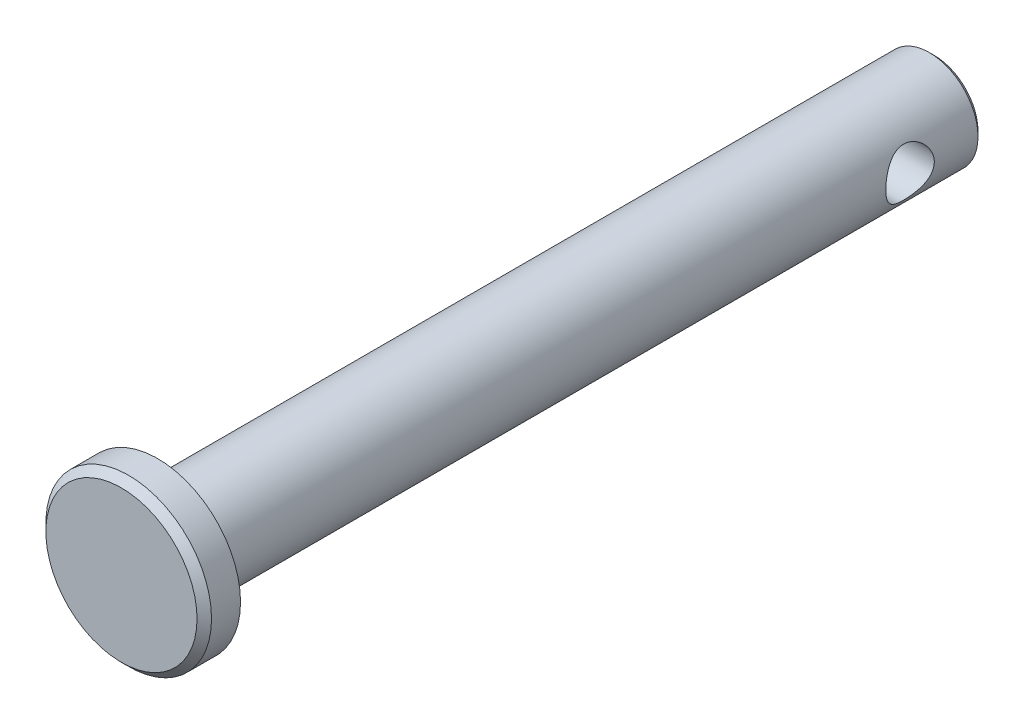
ISO-10303-21;
HEADER;
FILE_DESCRIPTION(('STEP AP214'),'2;1');
FILE_NAME('part.step','',(''),(''),'','','');
FILE_SCHEMA(('AUTOMOTIVE_DESIGN { 1 0 10303 214 1 1 1 1 }'));
ENDSEC;
DATA;
#1=APPLICATION_CONTEXT('core data for automotive mechanical design processes');
#2=APPLICATION_PROTOCOL_DEFINITION('international standard','automotive_design',2000,#1);
#3=PRODUCT_CONTEXT('',#1,'mechanical');
#4=PRODUCT('Part','Part','',(#3));
#5=PRODUCT_RELATED_PRODUCT_CATEGORY('part','',(#4));
#6=PRODUCT_DEFINITION_FORMATION('','',#4);
#7=PRODUCT_DEFINITION_CONTEXT('part definition',#1,'design');
#8=PRODUCT_DEFINITION('design','',#6,#7);
#9=PRODUCT_DEFINITION_SHAPE('','',#8);
#10=(LENGTH_UNIT() NAMED_UNIT(*) SI_UNIT(.MILLI.,.METRE.));
#11=(NAMED_UNIT(*) PLANE_ANGLE_UNIT() SI_UNIT($,.RADIAN.));
#12=(NAMED_UNIT(*) SI_UNIT($,.STERADIAN.) SOLID_ANGLE_UNIT());
#13=UNCERTAINTY_MEASURE_WITH_UNIT(LENGTH_MEASURE(1.E-05),#10,'distance_accuracy_value','');
#14=(GEOMETRIC_REPRESENTATION_CONTEXT(3) GLOBAL_UNCERTAINTY_ASSIGNED_CONTEXT((#13)) GLOBAL_UNIT_ASSIGNED_CONTEXT((#10,
#11,#12)) REPRESENTATION_CONTEXT('',''));
#15=CARTESIAN_POINT('',(0.,0.,0.));
#16=DIRECTION('',(0.,0.,1.));
#17=DIRECTION('',(1.,0.,0.));
#18=AXIS2_PLACEMENT_3D('',#15,#16,#17);
#19=CARTESIAN_POINT('',(0.,0.,19.05));
#20=DIRECTION('',(0.,0.,-1.));
#21=DIRECTION('',(-1.,0.,0.));
#22=AXIS2_PLACEMENT_3D('',#19,#20,#21);
#23=CYLINDRICAL_SURFACE('',#22,2.38125);
#24=CARTESIAN_POINT('',(0.,0.,-18.8118749999999));
#25=DIRECTION('',(0.,0.,1.));
#26=DIRECTION('',(1.,0.,0.));
#27=AXIS2_PLACEMENT_3D('',#24,#25,#26);
#28=CIRCLE('',#27,2.38125);
#29=CARTESIAN_POINT('',(2.38125,0.,-18.8118749999999));
#30=VERTEX_POINT('',#29);
#31=EDGE_CURVE('E36',#30,#30,#28,.T.);
#32=ORIENTED_EDGE('',*,*,#31,.T.);
#33=EDGE_LOOP('',(#32));
#34=FACE_BOUND('',#33,.T.);
#35=CARTESIAN_POINT('',(-2.38125,0.,-14.2875));
#36=CARTESIAN_POINT('',(-2.38124658771817,-0.0625934933908991,-14.2875039318241));
#37=CARTESIAN_POINT('',(-2.37875553370113,-0.125261607765469,-14.2924649933105));
#38=CARTESIAN_POINT('',(-2.36903604532025,-0.248745655116468,-14.3120898356559));
#39=CARTESIAN_POINT('',(-2.36179861446384,-0.309557840743265,-14.3267720429128));
#40=CARTESIAN_POINT('',(-2.34334382664568,-0.427355251873435,-14.3651213783844));
#41=CARTESIAN_POINT('',(-2.33214194770735,-0.484354349749462,-14.3887535887453));
#42=CARTESIAN_POINT('',(-2.30678565164099,-0.593493959385317,-14.4441512710626));
#43=CARTESIAN_POINT('',(-2.29263146732422,-0.645634853781904,-14.4759161017463));
#44=CARTESIAN_POINT('',(-2.26166669988499,-0.747126495522786,-14.5488627251684));
#45=CARTESIAN_POINT('',(-2.24474721461222,-0.796117610742266,-14.5904979643447));
#46=CARTESIAN_POINT('',(-2.2105140207503,-0.886753026544746,-14.6810271362285));
#47=CARTESIAN_POINT('',(-2.19320002298882,-0.928391728636495,-14.7299265485166));
#48=CARTESIAN_POINT('',(-2.15859063769341,-1.00637816303611,-14.8381442380263));
#49=CARTESIAN_POINT('',(-2.14140081986313,-1.04206516514117,-14.8979764170931));
#50=CARTESIAN_POINT('',(-2.11081118475794,-1.10271904514174,-15.0237436094086));
#51=CARTESIAN_POINT('',(-2.09740866244572,-1.12769358094429,-15.0896742220105));
#52=CARTESIAN_POINT('',(-2.07713897941891,-1.16458893898079,-15.221741891143));
#53=CARTESIAN_POINT('',(-2.06992860854359,-1.1772017235864,-15.2876303007427));
#54=CARTESIAN_POINT('',(-2.06194687719966,-1.19113338890835,-15.4209498037312));
#55=CARTESIAN_POINT('',(-2.06116915374352,-1.19246343021919,-15.4883793064747));
#56=CARTESIAN_POINT('',(-2.06586451337536,-1.18429955128952,-15.6141967977005));
#57=CARTESIAN_POINT('',(-2.07060121735085,-1.17608099119853,-15.6727017371749));
#58=CARTESIAN_POINT('',(-2.0845013483624,-1.15126275778341,-15.7873563983473));
#59=CARTESIAN_POINT('',(-2.09366618546583,-1.13466041470314,-15.8435053636291));
#60=CARTESIAN_POINT('',(-2.1155915160392,-1.09324351977209,-15.953457185961));
#61=CARTESIAN_POINT('',(-2.12843079040573,-1.06824668928498,-16.0071749310543));
#62=CARTESIAN_POINT('',(-2.15626240722546,-1.01089025937972,-16.109911454615));
#63=CARTESIAN_POINT('',(-2.17125571566414,-0.978527352789222,-16.1589281083239));
#64=CARTESIAN_POINT('',(-2.204003536286,-0.902572396630542,-16.2574143665474));
#65=CARTESIAN_POINT('',(-2.22186710625626,-0.858076839495929,-16.3061533401016));
#66=CARTESIAN_POINT('',(-2.25680138992047,-0.761470860938951,-16.3957818577598));
#67=CARTESIAN_POINT('',(-2.27387172175947,-0.709356821108762,-16.4366676505153));
#68=CARTESIAN_POINT('',(-2.30626428608779,-0.595927464756048,-16.5112132401635));
#69=CARTESIAN_POINT('',(-2.3214685301789,-0.53429724499805,-16.5444493125057));
#70=CARTESIAN_POINT('',(-2.34741102209979,-0.405367587816353,-16.5998092752043));
#71=CARTESIAN_POINT('',(-2.35815281492167,-0.338072701740849,-16.6219419890337));
#72=CARTESIAN_POINT('',(-2.37320534860897,-0.205700104133527,-16.6526472775502));
#73=CARTESIAN_POINT('',(-2.37797504664999,-0.140900384809102,-16.662191127561));
#74=CARTESIAN_POINT('',(-2.38211931649743,-0.0104532111897023,-16.670493945507));
#75=CARTESIAN_POINT('',(-2.38149644415062,0.0551938267825986,-16.6692580225895));
#76=CARTESIAN_POINT('',(-2.37519200776753,0.180061757270821,-16.6565976616014));
#77=CARTESIAN_POINT('',(-2.36990626897501,0.239386357709475,-16.6459703282183));
#78=CARTESIAN_POINT('',(-2.35532022721706,0.355290706146969,-16.6160790456499));
#79=CARTESIAN_POINT('',(-2.34601948166815,0.411870150775843,-16.5968141443165));
#80=CARTESIAN_POINT('',(-2.323912493394,0.522551749435383,-16.549689325903));
#81=CARTESIAN_POINT('',(-2.31101362357334,0.576536816435452,-16.5215994059547));
#82=CARTESIAN_POINT('',(-2.28295169421308,0.679205558772778,-16.4578813403714));
#83=CARTESIAN_POINT('',(-2.26778767095513,0.727886962326196,-16.4222499834997));
#84=CARTESIAN_POINT('',(-2.23490101029918,0.823635905061685,-16.3404227435881));
#85=CARTESIAN_POINT('',(-2.21707334772675,0.870075505159961,-16.2935330222475));
#86=CARTESIAN_POINT('',(-2.18196785003363,0.954710182325452,-16.19258911677));
#87=CARTESIAN_POINT('',(-2.1646904022613,0.992899556088159,-16.1385300179093));
#88=CARTESIAN_POINT('',(-2.13182825744162,1.06168973569882,-16.0214742742178));
#89=CARTESIAN_POINT('',(-2.11636605630571,1.09183348103051,-15.9581715861704));
#90=CARTESIAN_POINT('',(-2.090428799133,1.14071736472269,-15.8263708256536));
#91=CARTESIAN_POINT('',(-2.07994732092736,1.15947219672864,-15.7578795762595));
#92=CARTESIAN_POINT('',(-2.06646662138444,1.18331657161978,-15.6246787659056));
#93=CARTESIAN_POINT('',(-2.06284572182647,1.18954509883978,-15.5602373420111));
#94=CARTESIAN_POINT('',(-2.06175000375602,1.19144552443463,-15.4311583356499));
#95=CARTESIAN_POINT('',(-2.06427252119055,1.18712199863718,-15.3665208503446));
#96=CARTESIAN_POINT('',(-2.0745195450331,1.16910579328329,-15.2453774559884));
#97=CARTESIAN_POINT('',(-2.081725593681,1.1563448992644,-15.1886835027343));
#98=CARTESIAN_POINT('',(-2.09991741148739,1.12296816088622,-15.07830345781));
#99=CARTESIAN_POINT('',(-2.11090439637645,1.10234978978715,-15.0246183400718));
#100=CARTESIAN_POINT('',(-2.13632093965266,1.05229312174863,-14.9177872867941));
#101=CARTESIAN_POINT('',(-2.15093219477964,1.02235532346272,-14.864919904384));
#102=CARTESIAN_POINT('',(-2.18164566727434,0.955061000604871,-14.76461375536));
#103=CARTESIAN_POINT('',(-2.19774865799103,0.917700616381019,-14.7171778333514));
#104=CARTESIAN_POINT('',(-2.23197328511557,0.831298335810091,-14.6230872022555));
#105=CARTESIAN_POINT('',(-2.25010245755217,0.781388641146488,-14.5772277562503));
#106=CARTESIAN_POINT('',(-2.28454448778714,0.674078066156023,-14.4943556353612));
#107=CARTESIAN_POINT('',(-2.30085636405197,0.616673173627613,-14.4573477289956));
#108=CARTESIAN_POINT('',(-2.33002942662263,0.495218557463752,-14.3931842055862));
#109=CARTESIAN_POINT('',(-2.34286539970213,0.431124721872153,-14.3661000982945));
#110=CARTESIAN_POINT('',(-2.36340659560876,0.298539814353399,-14.3234471500715));
#111=CARTESIAN_POINT('',(-2.37112639390897,0.230061848926334,-14.3078455823685));
#112=CARTESIAN_POINT('',(-2.37762409336193,0.13406669253178,-14.2947658949378));
#113=CARTESIAN_POINT('',(-2.37898025606987,0.107348987707654,-14.2920450432218));
#114=CARTESIAN_POINT('',(-2.3807939546427,0.0537587806828975,-14.288411226369));
#115=CARTESIAN_POINT('',(-2.38125146570418,0.0268862742301637,-14.2874983111327));
#116=CARTESIAN_POINT('',(-2.38125,0.,-14.2875));
#117=B_SPLINE_CURVE_WITH_KNOTS('',3,(#35,#36,#37,#38,#39,#40,#41,#42,#43,#44,#45,#46,#47,#48,
#49,#50,#51,#52,#53,#54,#55,#56,#57,#58,#59,#60,#61,#62,#63,#64,#65,#66,#67,#68,#69,#70,#71,#72,
#73,#74,#75,#76,#77,#78,#79,#80,#81,#82,#83,#84,#85,#86,#87,#88,#89,#90,#91,#92,#93,#94,#95,#96,
#97,#98,#99,#100,#101,#102,#103,#104,#105,#106,#107,#108,#109,#110,#111,#112,#113,#114,#115,
#116),.UNSPECIFIED.,.T.,.F.,(4,2,2,2,2,2,2,2,2,2,2,2,2,2,2,2,2,2,2,2,2,2,2,2,2,2,2,2,2,2,2,2,2,
2,2,2,2,2,2,2,4),(0.,0.187671381491035,0.375699515747514,0.563001503883019,0.75028872744243,
0.948906406473726,1.14767467670684,1.36185743031615,1.57588681716391,1.77710320704462,
1.97812053569866,2.15509926337348,2.33213438424011,2.51329317200606,2.69453345625452,
2.8987544577565,3.10307277131562,3.31687910824069,3.53051527011183,3.72645730217446,
3.92230647121477,4.10297598058852,4.28366541066829,4.46952119208218,4.65545627297242,
4.85965036423512,5.06398516445249,5.27821543446363,5.4921687202949,5.68558331740252,
5.8789140564582,6.05382723196981,6.22879670208068,6.41552156348467,6.60234377481073,
6.81186617152195,7.02150118957733,7.23261841267422,7.44313156831559,7.52374130413948,
7.60435326481741),.UNSPECIFIED.);
#118=CARTESIAN_POINT('',(-2.38125,0.,-14.2875));
#119=VERTEX_POINT('',#118);
#120=EDGE_CURVE('E47',#119,#119,#117,.T.);
#121=ORIENTED_EDGE('',*,*,#120,.T.);
#122=EDGE_LOOP('',(#121));
#123=FACE_BOUND('',#122,.T.);
#124=CARTESIAN_POINT('',(2.38125,0.,-16.66875));
#125=CARTESIAN_POINT('',(2.38124658771817,-0.0625934933908996,-16.6687460681758));
#126=CARTESIAN_POINT('',(2.37875553370113,-0.12526160776547,-16.6637850066895));
#127=CARTESIAN_POINT('',(2.36903604532025,-0.248745655116469,-16.6441601643441));
#128=CARTESIAN_POINT('',(2.36179861446383,-0.309557840743266,-16.6294779570872));
#129=CARTESIAN_POINT('',(2.34334382664568,-0.427355251873435,-16.5911286216156));
#130=CARTESIAN_POINT('',(2.33214194770735,-0.484354349749462,-16.5674964112547));
#131=CARTESIAN_POINT('',(2.30678565164099,-0.593493959385318,-16.5120987289374));
#132=CARTESIAN_POINT('',(2.29263146732421,-0.645634853781904,-16.4803338982537));
#133=CARTESIAN_POINT('',(2.26166669988499,-0.747126495522786,-16.4073872748316));
#134=CARTESIAN_POINT('',(2.24474721461222,-0.796117610742266,-16.3657520356553));
#135=CARTESIAN_POINT('',(2.2105140207503,-0.886753026544747,-16.2752228637715));
#136=CARTESIAN_POINT('',(2.19320002298882,-0.928391728636496,-16.2263234514834));
#137=CARTESIAN_POINT('',(2.15859063769341,-1.00637816303612,-16.1181057619737));
#138=CARTESIAN_POINT('',(2.14140081986313,-1.04206516514117,-16.0582735829069));
#139=CARTESIAN_POINT('',(2.11081118475794,-1.10271904514174,-15.9325063905914));
#140=CARTESIAN_POINT('',(2.09740866244572,-1.12769358094429,-15.8665757779895));
#141=CARTESIAN_POINT('',(2.0771389794189,-1.16458893898079,-15.734508108857));
#142=CARTESIAN_POINT('',(2.06992860854359,-1.1772017235864,-15.6686196992573));
#143=CARTESIAN_POINT('',(2.06194687719966,-1.19113338890835,-15.5353001962688));
#144=CARTESIAN_POINT('',(2.06116915374352,-1.19246343021919,-15.4678706935253));
#145=CARTESIAN_POINT('',(2.06586451337536,-1.18429955128952,-15.3420532022995));
#146=CARTESIAN_POINT('',(2.07060121735085,-1.17608099119853,-15.2835482628251));
#147=CARTESIAN_POINT('',(2.0845013483624,-1.15126275778341,-15.1688936016527));
#148=CARTESIAN_POINT('',(2.09366618546583,-1.13466041470315,-15.1127446363709));
#149=CARTESIAN_POINT('',(2.1155915160392,-1.09324351977209,-15.002792814039));
#150=CARTESIAN_POINT('',(2.12843079040573,-1.06824668928498,-14.9490750689457));
#151=CARTESIAN_POINT('',(2.15626240722546,-1.01089025937972,-14.846338545385));
#152=CARTESIAN_POINT('',(2.17125571566414,-0.978527352789223,-14.7973218916761));
#153=CARTESIAN_POINT('',(2.20400353628599,-0.902572396630543,-14.6988356334526));
#154=CARTESIAN_POINT('',(2.22186710625626,-0.858076839495929,-14.6500966598984));
#155=CARTESIAN_POINT('',(2.25680138992047,-0.761470860938951,-14.5604681422402));
#156=CARTESIAN_POINT('',(2.27387172175947,-0.709356821108761,-14.5195823494847));
#157=CARTESIAN_POINT('',(2.30626428608779,-0.595927464756047,-14.4450367598365));
#158=CARTESIAN_POINT('',(2.3214685301789,-0.534297244998048,-14.4118006874943));
#159=CARTESIAN_POINT('',(2.34741102209979,-0.40536758781635,-14.3564407247957));
#160=CARTESIAN_POINT('',(2.35815281492167,-0.338072701740845,-14.3343080109663));
#161=CARTESIAN_POINT('',(2.37320534860897,-0.205700104133523,-14.3036027224498));
#162=CARTESIAN_POINT('',(2.37797504664999,-0.140900384809099,-14.294058872439));
#163=CARTESIAN_POINT('',(2.38211931649743,-0.0104532111896992,-14.285756054493));
#164=CARTESIAN_POINT('',(2.38149644415062,0.0551938267826013,-14.2869919774105));
#165=CARTESIAN_POINT('',(2.37519200776753,0.180061757270824,-14.2996523383986));
#166=CARTESIAN_POINT('',(2.36990626897501,0.239386357709477,-14.3102796717817));
#167=CARTESIAN_POINT('',(2.35532022721706,0.35529070614697,-14.3401709543501));
#168=CARTESIAN_POINT('',(2.34601948166815,0.411870150775843,-14.3594358556835));
#169=CARTESIAN_POINT('',(2.323912493394,0.522551749435383,-14.406560674097));
#170=CARTESIAN_POINT('',(2.31101362357334,0.576536816435452,-14.4346505940453));
#171=CARTESIAN_POINT('',(2.28295169421308,0.679205558772778,-14.4983686596286));
#172=CARTESIAN_POINT('',(2.26778767095513,0.727886962326195,-14.5340000165003));
#173=CARTESIAN_POINT('',(2.23490101029918,0.823635905061684,-14.6158272564119));
#174=CARTESIAN_POINT('',(2.21707334772675,0.870075505159962,-14.6627169777525));
#175=CARTESIAN_POINT('',(2.18196785003363,0.954710182325453,-14.76366088323));
#176=CARTESIAN_POINT('',(2.1646904022613,0.992899556088159,-14.8177199820907));
#177=CARTESIAN_POINT('',(2.13182825744162,1.06168973569882,-14.9347757257822));
#178=CARTESIAN_POINT('',(2.11636605630571,1.0918334810305,-14.9980784138296));
#179=CARTESIAN_POINT('',(2.090428799133,1.14071736472269,-15.1298791743464));
#180=CARTESIAN_POINT('',(2.07994732092736,1.15947219672864,-15.1983704237405));
#181=CARTESIAN_POINT('',(2.06646662138444,1.18331657161978,-15.3315712340944));
#182=CARTESIAN_POINT('',(2.06284572182647,1.18954509883978,-15.3960126579889));
#183=CARTESIAN_POINT('',(2.06175000375602,1.19144552443463,-15.5250916643501));
#184=CARTESIAN_POINT('',(2.06427252119055,1.18712199863718,-15.5897291496554));
#185=CARTESIAN_POINT('',(2.0745195450331,1.16910579328329,-15.7108725440116));
#186=CARTESIAN_POINT('',(2.081725593681,1.1563448992644,-15.7675664972657));
#187=CARTESIAN_POINT('',(2.09991741148739,1.12296816088622,-15.87794654219));
#188=CARTESIAN_POINT('',(2.11090439637645,1.10234978978715,-15.9316316599282));
#189=CARTESIAN_POINT('',(2.13632093965266,1.05229312174863,-16.0384627132059));
#190=CARTESIAN_POINT('',(2.15093219477964,1.02235532346272,-16.091330095616));
#191=CARTESIAN_POINT('',(2.18164566727434,0.95506100060487,-16.19163624464));
#192=CARTESIAN_POINT('',(2.19774865799103,0.917700616381017,-16.2390721666486));
#193=CARTESIAN_POINT('',(2.23197328511557,0.83129833581009,-16.3331627977445));
#194=CARTESIAN_POINT('',(2.25010245755217,0.781388641146487,-16.3790222437497));
#195=CARTESIAN_POINT('',(2.28454448778714,0.674078066156023,-16.4618943646388));
#196=CARTESIAN_POINT('',(2.30085636405197,0.616673173627612,-16.4989022710044));
#197=CARTESIAN_POINT('',(2.33002942662263,0.495218557463752,-16.5630657944137));
#198=CARTESIAN_POINT('',(2.34286539970213,0.431124721872154,-16.5901499017055));
#199=CARTESIAN_POINT('',(2.36340659560876,0.298539814353401,-16.6328028499285));
#200=CARTESIAN_POINT('',(2.37112639390897,0.230061848926336,-16.6484044176315));
#201=CARTESIAN_POINT('',(2.37762409336193,0.134066692531782,-16.6614841050622));
#202=CARTESIAN_POINT('',(2.37898025606987,0.107348987707656,-16.6642049567782));
#203=CARTESIAN_POINT('',(2.3807939546427,0.0537587806828985,-16.6678387736309));
#204=CARTESIAN_POINT('',(2.38125146570418,0.0268862742301642,-16.6687516888673));
#205=CARTESIAN_POINT('',(2.38125,0.,-16.66875));
#206=B_SPLINE_CURVE_WITH_KNOTS('',3,(#124,#125,#126,#127,#128,#129,#130,#131,#132,#133,#134,
#135,#136,#137,#138,#139,#140,#141,#142,#143,#144,#145,#146,#147,#148,#149,#150,#151,#152,#153,
#154,#155,#156,#157,#158,#159,#160,#161,#162,#163,#164,#165,#166,#167,#168,#169,#170,#171,#172,
#173,#174,#175,#176,#177,#178,#179,#180,#181,#182,#183,#184,#185,#186,#187,#188,#189,#190,#191,
#192,#193,#194,#195,#196,#197,#198,#199,#200,#201,#202,#203,#204,#205),.UNSPECIFIED.,.T.,.F.,(4,
2,2,2,2,2,2,2,2,2,2,2,2,2,2,2,2,2,2,2,2,2,2,2,2,2,2,2,2,2,2,2,2,2,2,2,2,2,2,2,4),(0.,
0.187671381491036,0.375699515747514,0.563001503883019,0.75028872744243,0.948906406473726,
1.14767467670684,1.36185743031616,1.57588681716391,1.77710320704462,1.97812053569865,
2.15509926337348,2.33213438424011,2.51329317200606,2.69453345625452,2.89875445775649,
3.10307277131562,3.31687910824069,3.53051527011184,3.72645730217447,3.92230647121477,
4.10297598058852,4.28366541066829,4.46952119208218,4.65545627297242,4.85965036423512,
5.06398516445249,5.27821543446363,5.4921687202949,5.68558331740252,5.8789140564582,
6.05382723196981,6.22879670208068,6.41552156348467,6.60234377481073,6.81186617152195,
7.02150118957733,7.23261841267422,7.44313156831559,7.52374130413948,7.60435326481741),.UNSPECIFIED.);
#207=CARTESIAN_POINT('',(2.38125,0.,-16.66875));
#208=VERTEX_POINT('',#207);
#209=EDGE_CURVE('E55',#208,#208,#206,.T.);
#210=ORIENTED_EDGE('',*,*,#209,.T.);
#211=EDGE_LOOP('',(#210));
#212=FACE_BOUND('',#211,.T.);
#213=CARTESIAN_POINT('',(0.,0.,19.05));
#214=DIRECTION('',(0.,0.,1.));
#215=DIRECTION('',(1.,0.,0.));
#216=AXIS2_PLACEMENT_3D('',#213,#214,#215);
#217=CIRCLE('',#216,2.38125);
#218=CARTESIAN_POINT('',(2.38125,0.,19.05));
#219=VERTEX_POINT('',#218);
#220=EDGE_CURVE('E93',#219,#219,#217,.T.);
#221=ORIENTED_EDGE('',*,*,#220,.F.);
#222=EDGE_LOOP('',(#221));
#223=FACE_BOUND('',#222,.T.);
#224=ADVANCED_FACE('F29',(#34,#123,#212,#223),#23,.T.);
#225=CARTESIAN_POINT('',(0.,0.,-19.05));
#226=DIRECTION('',(0.,0.,1.));
#227=DIRECTION('',(1.,0.,0.));
#228=AXIS2_PLACEMENT_3D('',#225,#226,#227);
#229=PLANE('',#228);
#230=CARTESIAN_POINT('',(0.,0.,-19.05));
#231=DIRECTION('',(0.,0.,1.));
#232=DIRECTION('',(1.,0.,0.));
#233=AXIS2_PLACEMENT_3D('',#230,#231,#232);
#234=CIRCLE('',#233,2.14312499999995);
#235=CARTESIAN_POINT('',(2.14312499999995,0.,-19.05));
#236=VERTEX_POINT('',#235);
#237=EDGE_CURVE('E10',#236,#236,#234,.F.);
#238=ORIENTED_EDGE('',*,*,#237,.T.);
#239=EDGE_LOOP('',(#238));
#240=FACE_BOUND('',#239,.T.);
#241=ADVANCED_FACE('F75',(#240),#229,.F.);
#242=CARTESIAN_POINT('',(0.,0.,19.05));
#243=DIRECTION('',(0.,0.,1.));
#244=DIRECTION('',(1.,0.,0.));
#245=AXIS2_PLACEMENT_3D('',#242,#243,#244);
#246=PLANE('',#245);
#247=CARTESIAN_POINT('',(0.,0.,19.05));
#248=DIRECTION('',(0.,0.,1.));
#249=DIRECTION('',(1.,0.,0.));
#250=AXIS2_PLACEMENT_3D('',#247,#248,#249);
#251=CIRCLE('',#250,4.064);
#252=CARTESIAN_POINT('',(4.064,0.,19.05));
#253=VERTEX_POINT('',#252);
#254=EDGE_CURVE('E54',#253,#253,#251,.T.);
#255=ORIENTED_EDGE('',*,*,#254,.F.);
#256=EDGE_LOOP('',(#255));
#257=FACE_BOUND('',#256,.T.);
#258=ORIENTED_EDGE('',*,*,#220,.T.);
#259=EDGE_LOOP('',(#258));
#260=FACE_BOUND('',#259,.T.);
#261=ADVANCED_FACE('F72',(#257,#260),#246,.F.);
#262=CARTESIAN_POINT('',(0.,0.,20.828));
#263=DIRECTION('',(0.,0.,-1.));
#264=DIRECTION('',(-1.,0.,0.));
#265=AXIS2_PLACEMENT_3D('',#262,#263,#264);
#266=CYLINDRICAL_SURFACE('',#265,4.064);
#267=CARTESIAN_POINT('',(0.,0.,20.4724));
#268=DIRECTION('',(0.,0.,1.));
#269=DIRECTION('',(1.,0.,0.));
#270=AXIS2_PLACEMENT_3D('',#267,#268,#269);
#271=CIRCLE('',#270,4.064);
#272=CARTESIAN_POINT('',(4.064,0.,20.4724));
#273=VERTEX_POINT('',#272);
#274=EDGE_CURVE('E40',#273,#273,#271,.F.);
#275=ORIENTED_EDGE('',*,*,#274,.T.);
#276=EDGE_LOOP('',(#275));
#277=FACE_BOUND('',#276,.T.);
#278=ORIENTED_EDGE('',*,*,#254,.T.);
#279=EDGE_LOOP('',(#278));
#280=FACE_BOUND('',#279,.T.);
#281=ADVANCED_FACE('F70',(#277,#280),#266,.T.);
#282=CARTESIAN_POINT('',(0.,0.,20.828));
#283=DIRECTION('',(0.,0.,1.));
#284=DIRECTION('',(1.,0.,0.));
#285=AXIS2_PLACEMENT_3D('',#282,#283,#284);
#286=PLANE('',#285);
#287=CARTESIAN_POINT('',(0.,0.,20.828));
#288=DIRECTION('',(0.,0.,1.));
#289=DIRECTION('',(1.,0.,0.));
#290=AXIS2_PLACEMENT_3D('',#287,#288,#289);
#291=CIRCLE('',#290,3.7084);
#292=CARTESIAN_POINT('',(3.7084,0.,20.828));
#293=VERTEX_POINT('',#292);
#294=EDGE_CURVE('E44',#293,#293,#291,.T.);
#295=ORIENTED_EDGE('',*,*,#294,.T.);
#296=EDGE_LOOP('',(#295));
#297=FACE_BOUND('',#296,.T.);
#298=ADVANCED_FACE('F66',(#297),#286,.T.);
#299=CARTESIAN_POINT('',(0.,0.,20.828));
#300=DIRECTION('',(0.,0.,-1.));
#301=DIRECTION('',(-1.,0.,0.));
#302=AXIS2_PLACEMENT_3D('',#299,#300,#301);
#303=CONICAL_SURFACE('',#302,3.7084,0.785398163397441);
#304=ORIENTED_EDGE('',*,*,#274,.F.);
#305=EDGE_LOOP('',(#304));
#306=FACE_BOUND('',#305,.T.);
#307=ORIENTED_EDGE('',*,*,#294,.F.);
#308=EDGE_LOOP('',(#307));
#309=FACE_BOUND('',#308,.T.);
#310=ADVANCED_FACE('F64',(#306,#309),#303,.T.);
#311=CARTESIAN_POINT('',(-4.064,0.,-15.478125));
#312=DIRECTION('',(1.,0.,0.));
#313=DIRECTION('',(0.,0.,-1.));
#314=AXIS2_PLACEMENT_3D('',#311,#312,#313);
#315=CYLINDRICAL_SURFACE('',#314,1.190625);
#316=ORIENTED_EDGE('',*,*,#209,.F.);
#317=EDGE_LOOP('',(#316));
#318=FACE_BOUND('',#317,.T.);
#319=ORIENTED_EDGE('',*,*,#120,.F.);
#320=EDGE_LOOP('',(#319));
#321=FACE_BOUND('',#320,.T.);
#322=ADVANCED_FACE('F60',(#318,#321),#315,.F.);
#323=CARTESIAN_POINT('',(0.,0.,-18.8118749999999));
#324=DIRECTION('',(0.,0.,1.));
#325=DIRECTION('',(1.,0.,0.));
#326=AXIS2_PLACEMENT_3D('',#323,#324,#325);
#327=CONICAL_SURFACE('',#326,2.38125,0.785398163397438);
#328=ORIENTED_EDGE('',*,*,#237,.F.);
#329=EDGE_LOOP('',(#328));
#330=FACE_BOUND('',#329,.T.);
#331=ORIENTED_EDGE('',*,*,#31,.F.);
#332=EDGE_LOOP('',(#331));
#333=FACE_BOUND('',#332,.T.);
#334=ADVANCED_FACE('F31',(#330,#333),#327,.T.);
#335=CLOSED_SHELL('',(#224,#241,#261,#281,#298,#310,#322,#334));
#336=MANIFOLD_SOLID_BREP('B2',#335);
#337=ADVANCED_BREP_SHAPE_REPRESENTATION('',(#18,#336),#14);
#338=SHAPE_DEFINITION_REPRESENTATION(#9,#337);
ENDSEC;
END-ISO-10303-21;
